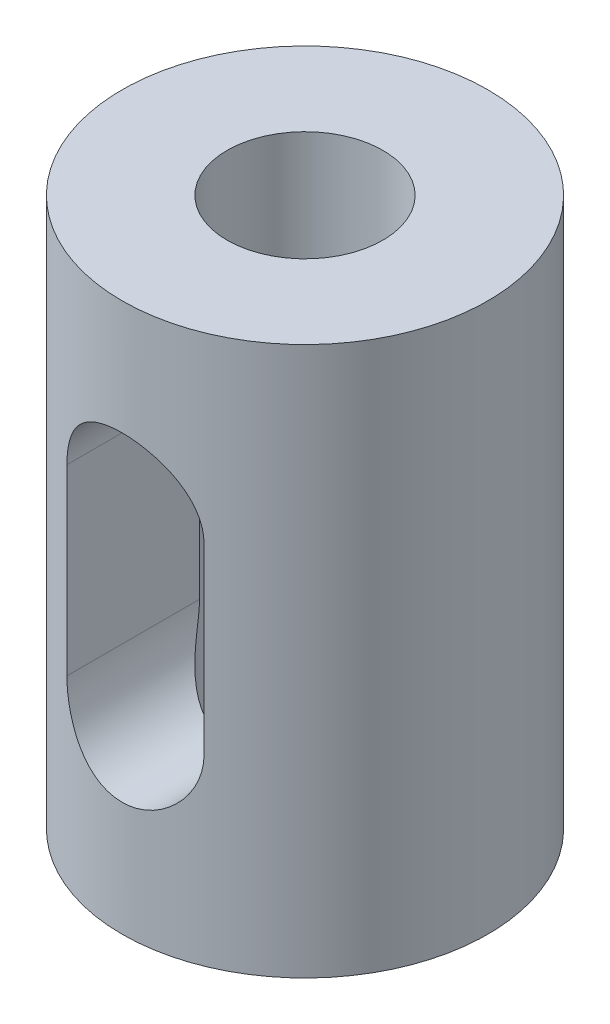
ISO-10303-21;
HEADER;
FILE_DESCRIPTION(('STEP AP214'),'2;1');
FILE_NAME('part.step','',(''),(''),'','','');
FILE_SCHEMA(('AUTOMOTIVE_DESIGN { 1 0 10303 214 1 1 1 1 }'));
ENDSEC;
DATA;
#1=APPLICATION_CONTEXT('core data for automotive mechanical design processes');
#2=APPLICATION_PROTOCOL_DEFINITION('international standard','automotive_design',2000,#1);
#3=PRODUCT_CONTEXT('',#1,'mechanical');
#4=PRODUCT('Part','Part','',(#3));
#5=PRODUCT_RELATED_PRODUCT_CATEGORY('part','',(#4));
#6=PRODUCT_DEFINITION_FORMATION('','',#4);
#7=PRODUCT_DEFINITION_CONTEXT('part definition',#1,'design');
#8=PRODUCT_DEFINITION('design','',#6,#7);
#9=PRODUCT_DEFINITION_SHAPE('','',#8);
#10=(LENGTH_UNIT() NAMED_UNIT(*) SI_UNIT(.MILLI.,.METRE.));
#11=(NAMED_UNIT(*) PLANE_ANGLE_UNIT() SI_UNIT($,.RADIAN.));
#12=(NAMED_UNIT(*) SI_UNIT($,.STERADIAN.) SOLID_ANGLE_UNIT());
#13=UNCERTAINTY_MEASURE_WITH_UNIT(LENGTH_MEASURE(1.E-05),#10,'distance_accuracy_value','');
#14=(GEOMETRIC_REPRESENTATION_CONTEXT(3) GLOBAL_UNCERTAINTY_ASSIGNED_CONTEXT((#13)) GLOBAL_UNIT_ASSIGNED_CONTEXT((#10,
#11,#12)) REPRESENTATION_CONTEXT('',''));
#15=CARTESIAN_POINT('',(0.,0.,0.));
#16=DIRECTION('',(0.,0.,1.));
#17=DIRECTION('',(1.,0.,0.));
#18=AXIS2_PLACEMENT_3D('',#15,#16,#17);
#19=CARTESIAN_POINT('',(0.,9.525,0.));
#20=DIRECTION('',(0.,-1.,0.));
#21=DIRECTION('',(0.,0.,-1.));
#22=AXIS2_PLACEMENT_3D('',#19,#20,#21);
#23=CYLINDRICAL_SURFACE('',#22,3.175);
#24=DIRECTION('',(0.,-1.,0.));
#25=VECTOR('',#24,1.);
#26=CARTESIAN_POINT('',(-1.190625,9.525,-2.94330377456609));
#27=LINE('',#26,#25);
#28=CARTESIAN_POINT('',(-1.190625,6.35,-2.94330377456609));
#29=VERTEX_POINT('',#28);
#30=CARTESIAN_POINT('',(-1.190625,3.175,-2.94330377456609));
#31=VERTEX_POINT('',#30);
#32=EDGE_CURVE('E165',#29,#31,#27,.T.);
#33=ORIENTED_EDGE('',*,*,#32,.T.);
#34=CARTESIAN_POINT('',(-1.190625,3.175,-2.94330377456609));
#35=CARTESIAN_POINT('',(-1.19062618848073,3.14277967690778,-2.94329995872857));
#36=CARTESIAN_POINT('',(-1.18931625076439,3.11057613112784,-2.94383351554502));
#37=CARTESIAN_POINT('',(-1.18409962328059,3.04642477238517,-2.94593703117006));
#38=CARTESIAN_POINT('',(-1.18019380538843,3.01447687720228,-2.94750664199915));
#39=CARTESIAN_POINT('',(-1.16466526629548,2.91959727251809,-2.95369436887438));
#40=CARTESIAN_POINT('',(-1.14923092772087,2.85734151969469,-2.95979205795841));
#41=CARTESIAN_POINT('',(-1.10879122478177,2.73655828217862,-2.97517516785815));
#42=CARTESIAN_POINT('',(-1.08379392479305,2.67802770444891,-2.98445790207025));
#43=CARTESIAN_POINT('',(-1.02500190069595,2.56592901845132,-3.00515645633822));
#44=CARTESIAN_POINT('',(-0.991199976239261,2.51236502065264,-3.01657402007336));
#45=CARTESIAN_POINT('',(-0.913976168234131,2.40911703854706,-3.04088474426551));
#46=CARTESIAN_POINT('',(-0.870190267274444,2.35971555113495,-3.05382115655563));
#47=CARTESIAN_POINT('',(-0.775013201823315,2.26875689804242,-3.07935139516824));
#48=CARTESIAN_POINT('',(-0.723620568591074,2.22720125080481,-3.09194515477271));
#49=CARTESIAN_POINT('',(-0.612531890043653,2.15174495493618,-3.11588859526652));
#50=CARTESIAN_POINT('',(-0.55261269395216,2.11815314820732,-3.1271813121393));
#51=CARTESIAN_POINT('',(-0.427476937704533,2.06164504557796,-3.14672690537256));
#52=CARTESIAN_POINT('',(-0.362262363264182,2.03872476946978,-3.15498091485232));
#53=CARTESIAN_POINT('',(-0.231370227719778,2.00520481068537,-3.16721085556145));
#54=CARTESIAN_POINT('',(-0.165833940311952,1.99411638870874,-3.17135594220028));
#55=CARTESIAN_POINT('',(-0.0337072593735785,1.98300879914146,-3.17550811124661));
#56=CARTESIAN_POINT('',(0.0328828035241809,1.98298622578848,-3.17551646682561));
#57=CARTESIAN_POINT('',(0.161721879430094,1.99372680869424,-3.17150165938149));
#58=CARTESIAN_POINT('',(0.224022668288448,2.00395639594589,-3.16767793539666));
#59=CARTESIAN_POINT('',(0.345948219071124,2.03401316519528,-3.15669026926481));
#60=CARTESIAN_POINT('',(0.405572828828377,2.05384089218802,-3.14952613744589));
#61=CARTESIAN_POINT('',(0.521484953024784,2.10277899912289,-3.13243730414583));
#62=CARTESIAN_POINT('',(0.577711250922168,2.13202031123295,-3.12247393335648));
#63=CARTESIAN_POINT('',(0.684598615222709,2.19883992982367,-3.10079480626558));
#64=CARTESIAN_POINT('',(0.735257863666696,2.23642094766869,-3.08907848045636));
#65=CARTESIAN_POINT('',(0.832712013169232,2.32141961062108,-3.06429285419527));
#66=CARTESIAN_POINT('',(0.879108122886125,2.36928373006591,-3.05118449980405));
#67=CARTESIAN_POINT('',(0.963372193449838,2.47220115666236,-3.02563755595115));
#68=CARTESIAN_POINT('',(1.00123680232957,2.5272572761264,-3.01319923119479));
#69=CARTESIAN_POINT('',(1.06813348661141,2.64458293505346,-2.99015045178193));
#70=CARTESIAN_POINT('',(1.09694552938089,2.70698785949867,-2.97958790430647));
#71=CARTESIAN_POINT('',(1.14346922163723,2.836232517962,-2.96204837787692));
#72=CARTESIAN_POINT('',(1.16119952777849,2.90306458766553,-2.95506537616461));
#73=CARTESIAN_POINT('',(1.17887172316472,3.00464618275791,-2.94803692564227));
#74=CARTESIAN_POINT('',(1.18327510053614,3.03855622405695,-2.94626884394537));
#75=CARTESIAN_POINT('',(1.18915107766906,3.10663754216694,-2.94390042682448));
#76=CARTESIAN_POINT('',(1.1906264013445,3.1408085464671,-2.94329900608927));
#77=CARTESIAN_POINT('',(1.190625,3.175,-2.94330377456609));
#78=B_SPLINE_CURVE_WITH_KNOTS('',3,(#34,#35,#36,#37,#38,#39,#40,#41,#42,#43,#44,#45,#46,#47,#48,
#49,#50,#51,#52,#53,#54,#55,#56,#57,#58,#59,#60,#61,#62,#63,#64,#65,#66,#67,#68,#69,#70,#71,#72,
#73,#74,#75,#76,#77),.UNSPECIFIED.,.F.,.F.,(4,2,2,2,2,2,2,2,2,2,2,2,2,2,2,2,2,2,2,2,2,4),(0.,
0.0965973633725355,0.19316229908422,0.385439495019381,0.577554901150599,0.769827913629831,
0.970740592641539,1.171692115472,1.37948621931291,1.58720275906571,1.78596071876867,
1.98465750622697,2.17352376479971,2.36240074870515,2.5540273495621,2.74571634263585,
2.94860657699107,3.151576387038,3.35915405166445,3.56638130093289,3.66897446974835,
3.77147215322594),.UNSPECIFIED.);
#79=CARTESIAN_POINT('',(1.190625,3.175,-2.94330377456609));
#80=VERTEX_POINT('',#79);
#81=EDGE_CURVE('E121',#31,#80,#78,.T.);
#82=ORIENTED_EDGE('',*,*,#81,.T.);
#83=DIRECTION('',(0.,-1.,0.));
#84=VECTOR('',#83,1.);
#85=CARTESIAN_POINT('',(1.190625,9.525,-2.94330377456609));
#86=LINE('',#85,#84);
#87=CARTESIAN_POINT('',(1.190625,6.35,-2.94330377456609));
#88=VERTEX_POINT('',#87);
#89=EDGE_CURVE('E171',#80,#88,#86,.F.);
#90=ORIENTED_EDGE('',*,*,#89,.T.);
#91=CARTESIAN_POINT('',(1.190625,6.35,-2.94330377456609));
#92=CARTESIAN_POINT('',(1.19062618848074,6.38222032309222,-2.94329995872857));
#93=CARTESIAN_POINT('',(1.18931625076439,6.41442386887216,-2.94383351554502));
#94=CARTESIAN_POINT('',(1.18409962328059,6.47857522761483,-2.94593703117006));
#95=CARTESIAN_POINT('',(1.18019380538843,6.51052312279772,-2.94750664199915));
#96=CARTESIAN_POINT('',(1.16466526629548,6.60540272748191,-2.95369436887438));
#97=CARTESIAN_POINT('',(1.14923092772087,6.66765848030531,-2.95979205795841));
#98=CARTESIAN_POINT('',(1.10879122478177,6.78844171782138,-2.97517516785815));
#99=CARTESIAN_POINT('',(1.08379392479306,6.84697229555109,-2.98445790207025));
#100=CARTESIAN_POINT('',(1.02500190069595,6.95907098154868,-3.00515645633822));
#101=CARTESIAN_POINT('',(0.991199976239262,7.01263497934736,-3.01657402007336));
#102=CARTESIAN_POINT('',(0.913976168234133,7.11588296145294,-3.04088474426551));
#103=CARTESIAN_POINT('',(0.870190267274445,7.16528444886505,-3.05382115655563));
#104=CARTESIAN_POINT('',(0.775013201823316,7.25624310195759,-3.07935139516824));
#105=CARTESIAN_POINT('',(0.723620568591076,7.29779874919519,-3.09194515477271));
#106=CARTESIAN_POINT('',(0.612531890043654,7.37325504506382,-3.11588859526652));
#107=CARTESIAN_POINT('',(0.552612693952161,7.40684685179268,-3.1271813121393));
#108=CARTESIAN_POINT('',(0.427476937704534,7.46335495442204,-3.14672690537256));
#109=CARTESIAN_POINT('',(0.362262363264184,7.48627523053022,-3.15498091485232));
#110=CARTESIAN_POINT('',(0.23137022771978,7.51979518931463,-3.16721085556145));
#111=CARTESIAN_POINT('',(0.165833940311954,7.53088361129126,-3.17135594220028));
#112=CARTESIAN_POINT('',(0.0337072593735799,7.54199120085854,-3.17550811124661));
#113=CARTESIAN_POINT('',(-0.0328828035241794,7.54201377421152,-3.17551646682561));
#114=CARTESIAN_POINT('',(-0.161721879430092,7.53127319130576,-3.17150165938149));
#115=CARTESIAN_POINT('',(-0.224022668288447,7.52104360405411,-3.16767793539666));
#116=CARTESIAN_POINT('',(-0.345948219071122,7.49098683480472,-3.15669026926481));
#117=CARTESIAN_POINT('',(-0.405572828828375,7.47115910781198,-3.14952613744589));
#118=CARTESIAN_POINT('',(-0.521484953024782,7.42222100087711,-3.13243730414583));
#119=CARTESIAN_POINT('',(-0.577711250922167,7.39297968876705,-3.12247393335648));
#120=CARTESIAN_POINT('',(-0.684598615222707,7.32616007017633,-3.10079480626558));
#121=CARTESIAN_POINT('',(-0.735257863666694,7.28857905233131,-3.08907848045636));
#122=CARTESIAN_POINT('',(-0.832712013169231,7.20358038937892,-3.06429285419527));
#123=CARTESIAN_POINT('',(-0.879108122886124,7.15571626993409,-3.05118449980405));
#124=CARTESIAN_POINT('',(-0.963372193449837,7.05279884333764,-3.02563755595115));
#125=CARTESIAN_POINT('',(-1.00123680232957,6.9977427238736,-3.01319923119479));
#126=CARTESIAN_POINT('',(-1.06813348661141,6.88041706494654,-2.99015045178193));
#127=CARTESIAN_POINT('',(-1.09694552938088,6.81801214050133,-2.97958790430647));
#128=CARTESIAN_POINT('',(-1.14346922163722,6.688767482038,-2.96204837787692));
#129=CARTESIAN_POINT('',(-1.16119952777849,6.62193541233447,-2.95506537616461));
#130=CARTESIAN_POINT('',(-1.17887172316472,6.52035381724209,-2.94803692564228));
#131=CARTESIAN_POINT('',(-1.18327510053614,6.48644377594305,-2.94626884394537));
#132=CARTESIAN_POINT('',(-1.18915107766906,6.41836245783306,-2.94390042682448));
#133=CARTESIAN_POINT('',(-1.1906264013445,6.3841914535329,-2.94329900608927));
#134=CARTESIAN_POINT('',(-1.190625,6.35,-2.94330377456609));
#135=B_SPLINE_CURVE_WITH_KNOTS('',3,(#91,#92,#93,#94,#95,#96,#97,#98,#99,#100,#101,#102,#103,
#104,#105,#106,#107,#108,#109,#110,#111,#112,#113,#114,#115,#116,#117,#118,#119,#120,#121,#122,
#123,#124,#125,#126,#127,#128,#129,#130,#131,#132,#133,#134),.UNSPECIFIED.,.F.,.F.,(4,2,2,2,2,2,
2,2,2,2,2,2,2,2,2,2,2,2,2,2,2,4),(0.,0.0965973633725355,0.19316229908422,0.38543949501938,
0.5775549011506,0.769827913629831,0.97074059264154,1.171692115472,1.37948621931291,
1.58720275906571,1.78596071876867,1.98465750622696,2.17352376479971,2.36240074870515,
2.5540273495621,2.74571634263585,2.94860657699107,3.151576387038,3.35915405166445,
3.5663813009329,3.66897446974835,3.77147215322594),.UNSPECIFIED.);
#136=EDGE_CURVE('E177',#88,#29,#135,.T.);
#137=ORIENTED_EDGE('',*,*,#136,.T.);
#138=EDGE_LOOP('',(#33,#82,#90,#137));
#139=FACE_BOUND('',#138,.T.);
#140=DIRECTION('',(0.,-1.,0.));
#141=VECTOR('',#140,1.);
#142=CARTESIAN_POINT('',(1.190625,9.525,2.94330377456609));
#143=LINE('',#142,#141);
#144=CARTESIAN_POINT('',(1.190625,6.35,2.94330377456609));
#145=VERTEX_POINT('',#144);
#146=CARTESIAN_POINT('',(1.190625,3.175,2.94330377456609));
#147=VERTEX_POINT('',#146);
#148=EDGE_CURVE('E174',#145,#147,#143,.T.);
#149=ORIENTED_EDGE('',*,*,#148,.T.);
#150=CARTESIAN_POINT('',(1.190625,3.175,2.94330377456609));
#151=CARTESIAN_POINT('',(1.19062618848074,3.14277967690778,2.94329995872857));
#152=CARTESIAN_POINT('',(1.18931625076439,3.11057613112784,2.94383351554502));
#153=CARTESIAN_POINT('',(1.18409962328059,3.04642477238517,2.94593703117006));
#154=CARTESIAN_POINT('',(1.18019380538843,3.01447687720228,2.94750664199915));
#155=CARTESIAN_POINT('',(1.16466526629548,2.91959727251809,2.95369436887438));
#156=CARTESIAN_POINT('',(1.14923092772087,2.85734151969469,2.95979205795841));
#157=CARTESIAN_POINT('',(1.10879122478177,2.73655828217862,2.97517516785815));
#158=CARTESIAN_POINT('',(1.08379392479306,2.67802770444891,2.98445790207024));
#159=CARTESIAN_POINT('',(1.02500190069595,2.56592901845132,3.00515645633822));
#160=CARTESIAN_POINT('',(0.991199976239262,2.51236502065264,3.01657402007336));
#161=CARTESIAN_POINT('',(0.913976168234133,2.40911703854706,3.04088474426551));
#162=CARTESIAN_POINT('',(0.870190267274446,2.35971555113495,3.05382115655563));
#163=CARTESIAN_POINT('',(0.775013201823317,2.26875689804242,3.07935139516824));
#164=CARTESIAN_POINT('',(0.723620568591076,2.22720125080481,3.09194515477271));
#165=CARTESIAN_POINT('',(0.612531890043654,2.15174495493618,3.11588859526652));
#166=CARTESIAN_POINT('',(0.552612693952162,2.11815314820732,3.1271813121393));
#167=CARTESIAN_POINT('',(0.427476937704534,2.06164504557796,3.14672690537256));
#168=CARTESIAN_POINT('',(0.362262363264184,2.03872476946978,3.15498091485232));
#169=CARTESIAN_POINT('',(0.23137022771978,2.00520481068537,3.16721085556145));
#170=CARTESIAN_POINT('',(0.165833940311954,1.99411638870874,3.17135594220028));
#171=CARTESIAN_POINT('',(0.0337072593735801,1.98300879914146,3.17550811124661));
#172=CARTESIAN_POINT('',(-0.0328828035241793,1.98298622578848,3.17551646682561));
#173=CARTESIAN_POINT('',(-0.161721879430092,1.99372680869424,3.17150165938149));
#174=CARTESIAN_POINT('',(-0.224022668288447,2.00395639594589,3.16767793539666));
#175=CARTESIAN_POINT('',(-0.345948219071122,2.03401316519528,3.15669026926481));
#176=CARTESIAN_POINT('',(-0.405572828828375,2.05384089218802,3.14952613744589));
#177=CARTESIAN_POINT('',(-0.521484953024782,2.10277899912289,3.13243730414583));
#178=CARTESIAN_POINT('',(-0.577711250922167,2.13202031123295,3.12247393335648));
#179=CARTESIAN_POINT('',(-0.684598615222707,2.19883992982367,3.10079480626558));
#180=CARTESIAN_POINT('',(-0.735257863666694,2.23642094766869,3.08907848045636));
#181=CARTESIAN_POINT('',(-0.832712013169231,2.32141961062108,3.06429285419527));
#182=CARTESIAN_POINT('',(-0.879108122886124,2.36928373006591,3.05118449980405));
#183=CARTESIAN_POINT('',(-0.963372193449837,2.47220115666236,3.02563755595115));
#184=CARTESIAN_POINT('',(-1.00123680232957,2.5272572761264,3.01319923119479));
#185=CARTESIAN_POINT('',(-1.06813348661141,2.64458293505346,2.99015045178193));
#186=CARTESIAN_POINT('',(-1.09694552938088,2.70698785949867,2.97958790430647));
#187=CARTESIAN_POINT('',(-1.14346922163723,2.836232517962,2.96204837787692));
#188=CARTESIAN_POINT('',(-1.16119952777849,2.90306458766553,2.95506537616461));
#189=CARTESIAN_POINT('',(-1.17887172316472,3.00464618275791,2.94803692564228));
#190=CARTESIAN_POINT('',(-1.18327510053614,3.03855622405695,2.94626884394537));
#191=CARTESIAN_POINT('',(-1.18915107766906,3.10663754216693,2.94390042682448));
#192=CARTESIAN_POINT('',(-1.1906264013445,3.1408085464671,2.94329900608927));
#193=CARTESIAN_POINT('',(-1.190625,3.175,2.94330377456609));
#194=B_SPLINE_CURVE_WITH_KNOTS('',3,(#150,#151,#152,#153,#154,#155,#156,#157,#158,#159,#160,
#161,#162,#163,#164,#165,#166,#167,#168,#169,#170,#171,#172,#173,#174,#175,#176,#177,#178,#179,
#180,#181,#182,#183,#184,#185,#186,#187,#188,#189,#190,#191,#192,#193),.UNSPECIFIED.,.F.,.F.,(4,
2,2,2,2,2,2,2,2,2,2,2,2,2,2,2,2,2,2,2,2,4),(0.,0.0965973633725355,0.19316229908422,
0.38543949501938,0.577554901150599,0.769827913629831,0.970740592641539,1.171692115472,
1.37948621931291,1.58720275906571,1.78596071876867,1.98465750622697,2.17352376479971,
2.36240074870515,2.5540273495621,2.74571634263585,2.94860657699107,3.151576387038,
3.35915405166445,3.5663813009329,3.66897446974835,3.77147215322594),.UNSPECIFIED.);
#195=CARTESIAN_POINT('',(-1.190625,3.175,2.94330377456609));
#196=VERTEX_POINT('',#195);
#197=EDGE_CURVE('E164',#147,#196,#194,.T.);
#198=ORIENTED_EDGE('',*,*,#197,.T.);
#199=DIRECTION('',(0.,-1.,0.));
#200=VECTOR('',#199,1.);
#201=CARTESIAN_POINT('',(-1.190625,9.525,2.94330377456609));
#202=LINE('',#201,#200);
#203=CARTESIAN_POINT('',(-1.190625,6.35,2.94330377456609));
#204=VERTEX_POINT('',#203);
#205=EDGE_CURVE('E216',#196,#204,#202,.F.);
#206=ORIENTED_EDGE('',*,*,#205,.T.);
#207=CARTESIAN_POINT('',(-1.190625,6.35,2.94330377456609));
#208=CARTESIAN_POINT('',(-1.19062618848073,6.38222032309222,2.94329995872857));
#209=CARTESIAN_POINT('',(-1.18931625076439,6.41442386887216,2.94383351554502));
#210=CARTESIAN_POINT('',(-1.18409962328059,6.47857522761483,2.94593703117006));
#211=CARTESIAN_POINT('',(-1.18019380538843,6.51052312279772,2.94750664199916));
#212=CARTESIAN_POINT('',(-1.16466526629548,6.60540272748191,2.95369436887438));
#213=CARTESIAN_POINT('',(-1.14923092772087,6.66765848030531,2.95979205795841));
#214=CARTESIAN_POINT('',(-1.10879122478177,6.78844171782138,2.97517516785815));
#215=CARTESIAN_POINT('',(-1.08379392479305,6.84697229555109,2.98445790207025));
#216=CARTESIAN_POINT('',(-1.02500190069595,6.95907098154868,3.00515645633822));
#217=CARTESIAN_POINT('',(-0.991199976239261,7.01263497934736,3.01657402007336));
#218=CARTESIAN_POINT('',(-0.913976168234131,7.11588296145294,3.04088474426551));
#219=CARTESIAN_POINT('',(-0.870190267274444,7.16528444886505,3.05382115655563));
#220=CARTESIAN_POINT('',(-0.775013201823315,7.25624310195759,3.07935139516824));
#221=CARTESIAN_POINT('',(-0.723620568591074,7.29779874919519,3.09194515477271));
#222=CARTESIAN_POINT('',(-0.612531890043652,7.37325504506382,3.11588859526652));
#223=CARTESIAN_POINT('',(-0.55261269395216,7.40684685179269,3.1271813121393));
#224=CARTESIAN_POINT('',(-0.427476937704533,7.46335495442204,3.14672690537256));
#225=CARTESIAN_POINT('',(-0.362262363264182,7.48627523053022,3.15498091485232));
#226=CARTESIAN_POINT('',(-0.231370227719778,7.51979518931463,3.16721085556145));
#227=CARTESIAN_POINT('',(-0.165833940311952,7.53088361129126,3.17135594220028));
#228=CARTESIAN_POINT('',(-0.0337072593735782,7.54199120085854,3.17550811124661));
#229=CARTESIAN_POINT('',(0.0328828035241812,7.54201377421152,3.17551646682561));
#230=CARTESIAN_POINT('',(0.161721879430094,7.53127319130576,3.17150165938149));
#231=CARTESIAN_POINT('',(0.224022668288449,7.52104360405411,3.16767793539666));
#232=CARTESIAN_POINT('',(0.345948219071124,7.49098683480472,3.15669026926481));
#233=CARTESIAN_POINT('',(0.405572828828377,7.47115910781198,3.14952613744589));
#234=CARTESIAN_POINT('',(0.521484953024784,7.42222100087711,3.13243730414583));
#235=CARTESIAN_POINT('',(0.577711250922168,7.39297968876705,3.12247393335648));
#236=CARTESIAN_POINT('',(0.684598615222709,7.32616007017633,3.10079480626558));
#237=CARTESIAN_POINT('',(0.735257863666696,7.28857905233131,3.08907848045636));
#238=CARTESIAN_POINT('',(0.832712013169232,7.20358038937892,3.06429285419527));
#239=CARTESIAN_POINT('',(0.879108122886125,7.15571626993409,3.05118449980405));
#240=CARTESIAN_POINT('',(0.963372193449838,7.05279884333764,3.02563755595115));
#241=CARTESIAN_POINT('',(1.00123680232957,6.9977427238736,3.01319923119479));
#242=CARTESIAN_POINT('',(1.06813348661141,6.88041706494654,2.99015045178193));
#243=CARTESIAN_POINT('',(1.09694552938089,6.81801214050133,2.97958790430647));
#244=CARTESIAN_POINT('',(1.14346922163723,6.688767482038,2.96204837787692));
#245=CARTESIAN_POINT('',(1.16119952777849,6.62193541233447,2.95506537616461));
#246=CARTESIAN_POINT('',(1.17887172316472,6.52035381724209,2.94803692564227));
#247=CARTESIAN_POINT('',(1.18327510053614,6.48644377594305,2.94626884394537));
#248=CARTESIAN_POINT('',(1.18915107766906,6.41836245783306,2.94390042682448));
#249=CARTESIAN_POINT('',(1.1906264013445,6.3841914535329,2.94329900608927));
#250=CARTESIAN_POINT('',(1.190625,6.35,2.94330377456609));
#251=B_SPLINE_CURVE_WITH_KNOTS('',3,(#207,#208,#209,#210,#211,#212,#213,#214,#215,#216,#217,
#218,#219,#220,#221,#222,#223,#224,#225,#226,#227,#228,#229,#230,#231,#232,#233,#234,#235,#236,
#237,#238,#239,#240,#241,#242,#243,#244,#245,#246,#247,#248,#249,#250),.UNSPECIFIED.,.F.,.F.,(4,
2,2,2,2,2,2,2,2,2,2,2,2,2,2,2,2,2,2,2,2,4),(0.,0.0965973633725346,0.19316229908422,
0.385439495019381,0.5775549011506,0.769827913629832,0.97074059264154,1.171692115472,
1.37948621931291,1.58720275906572,1.78596071876867,1.98465750622697,2.17352376479971,
2.36240074870515,2.5540273495621,2.74571634263585,2.94860657699107,3.151576387038,
3.35915405166445,3.5663813009329,3.66897446974835,3.77147215322594),.UNSPECIFIED.);
#252=EDGE_CURVE('E182',#204,#145,#251,.T.);
#253=ORIENTED_EDGE('',*,*,#252,.T.);
#254=EDGE_LOOP('',(#149,#198,#206,#253));
#255=FACE_BOUND('',#254,.T.);
#256=CARTESIAN_POINT('',(0.,9.525,0.));
#257=DIRECTION('',(0.,1.,0.));
#258=DIRECTION('',(0.,0.,1.));
#259=AXIS2_PLACEMENT_3D('',#256,#257,#258);
#260=CIRCLE('',#259,3.175);
#261=CARTESIAN_POINT('',(0.,9.525,3.175));
#262=VERTEX_POINT('',#261);
#263=EDGE_CURVE('E115',#262,#262,#260,.T.);
#264=ORIENTED_EDGE('',*,*,#263,.F.);
#265=EDGE_LOOP('',(#264));
#266=FACE_BOUND('',#265,.T.);
#267=CARTESIAN_POINT('',(0.,0.,0.));
#268=DIRECTION('',(0.,1.,0.));
#269=DIRECTION('',(0.,0.,1.));
#270=AXIS2_PLACEMENT_3D('',#267,#268,#269);
#271=CIRCLE('',#270,3.175);
#272=CARTESIAN_POINT('',(0.,0.,3.175));
#273=VERTEX_POINT('',#272);
#274=EDGE_CURVE('E229',#273,#273,#271,.T.);
#275=ORIENTED_EDGE('',*,*,#274,.T.);
#276=EDGE_LOOP('',(#275));
#277=FACE_BOUND('',#276,.T.);
#278=ADVANCED_FACE('F36',(#139,#255,#266,#277),#23,.T.);
#279=CARTESIAN_POINT('',(0.,9.525,0.));
#280=DIRECTION('',(0.,1.,0.));
#281=DIRECTION('',(0.,0.,1.));
#282=AXIS2_PLACEMENT_3D('',#279,#280,#281);
#283=PLANE('',#282);
#284=CARTESIAN_POINT('',(0.,9.525,0.));
#285=DIRECTION('',(0.,1.,0.));
#286=DIRECTION('',(0.,0.,1.));
#287=AXIS2_PLACEMENT_3D('',#284,#285,#286);
#288=CIRCLE('',#287,1.35254999999999);
#289=CARTESIAN_POINT('',(0.,9.525,1.35254999999999));
#290=VERTEX_POINT('',#289);
#291=EDGE_CURVE('E223',#290,#290,#288,.T.);
#292=ORIENTED_EDGE('',*,*,#291,.F.);
#293=EDGE_LOOP('',(#292));
#294=FACE_BOUND('',#293,.T.);
#295=ORIENTED_EDGE('',*,*,#263,.T.);
#296=EDGE_LOOP('',(#295));
#297=FACE_BOUND('',#296,.T.);
#298=ADVANCED_FACE('F239',(#294,#297),#283,.T.);
#299=CARTESIAN_POINT('',(0.,0.,0.));
#300=DIRECTION('',(0.,1.,0.));
#301=DIRECTION('',(0.,0.,1.));
#302=AXIS2_PLACEMENT_3D('',#299,#300,#301);
#303=PLANE('',#302);
#304=CARTESIAN_POINT('',(0.,0.,0.));
#305=DIRECTION('',(0.,1.,0.));
#306=DIRECTION('',(0.,0.,1.));
#307=AXIS2_PLACEMENT_3D('',#304,#305,#306);
#308=CIRCLE('',#307,1.35255);
#309=CARTESIAN_POINT('',(0.,0.,1.35255));
#310=VERTEX_POINT('',#309);
#311=EDGE_CURVE('E225',#310,#310,#308,.T.);
#312=ORIENTED_EDGE('',*,*,#311,.T.);
#313=EDGE_LOOP('',(#312));
#314=FACE_BOUND('',#313,.T.);
#315=ORIENTED_EDGE('',*,*,#274,.F.);
#316=EDGE_LOOP('',(#315));
#317=FACE_BOUND('',#316,.T.);
#318=ADVANCED_FACE('F237',(#314,#317),#303,.F.);
#319=CARTESIAN_POINT('',(0.,9.525,0.));
#320=DIRECTION('',(0.,1.,0.));
#321=DIRECTION('',(0.,0.,1.));
#322=AXIS2_PLACEMENT_3D('',#319,#320,#321);
#323=CYLINDRICAL_SURFACE('',#322,1.35255);
#324=DIRECTION('',(0.,1.,0.));
#325=VECTOR('',#324,1.);
#326=CARTESIAN_POINT('',(1.190625,9.525,0.641719262508916));
#327=LINE('',#326,#325);
#328=CARTESIAN_POINT('',(1.190625,3.175,0.641719262508915));
#329=VERTEX_POINT('',#328);
#330=CARTESIAN_POINT('',(1.190625,6.35,0.641719262508915));
#331=VERTEX_POINT('',#330);
#332=EDGE_CURVE('E49',#329,#331,#327,.T.);
#333=ORIENTED_EDGE('',*,*,#332,.T.);
#334=CARTESIAN_POINT('',(1.190625,6.35,0.641719262508915));
#335=CARTESIAN_POINT('',(1.19066571986986,6.38834607020843,0.641557283796456));
#336=CARTESIAN_POINT('',(1.18877671130535,6.42640752659745,0.645159975697117));
#337=CARTESIAN_POINT('',(1.18163354304275,6.50054670988399,0.658189685094697));
#338=CARTESIAN_POINT('',(1.17643868152506,6.53664746325981,0.667513969199227));
#339=CARTESIAN_POINT('',(1.16007943597601,6.62305249196192,0.695670267302342));
#340=CARTESIAN_POINT('',(1.14726605696047,6.67221514491697,0.716904554229075));
#341=CARTESIAN_POINT('',(1.11637320142792,6.76689860709206,0.764143578702337));
#342=CARTESIAN_POINT('',(1.09824091278728,6.81237675413772,0.790195139104773));
#343=CARTESIAN_POINT('',(1.06119209954145,6.89126245783644,0.839055412831132));
#344=CARTESIAN_POINT('',(1.04311725574554,6.92529499603825,0.861506509468474));
#345=CARTESIAN_POINT('',(1.00392780188969,6.99124028807586,0.9068748266963));
#346=CARTESIAN_POINT('',(0.982811517166428,7.02315185983498,0.929792298070678));
#347=CARTESIAN_POINT('',(0.915027051080603,7.11560207867653,0.998103073778938));
#348=CARTESIAN_POINT('',(0.863794173154389,7.17312936913519,1.04323591236457));
#349=CARTESIAN_POINT('',(0.762372803561192,7.26648750959074,1.11857217043411));
#350=CARTESIAN_POINT('',(0.714714855916177,7.30425220432807,1.14980592809482));
#351=CARTESIAN_POINT('',(0.612166951629826,7.37305309974829,1.20751261864862));
#352=CARTESIAN_POINT('',(0.557287251332537,7.40409868057973,1.23399217966486));
#353=CARTESIAN_POINT('',(0.451951626487715,7.45273589459485,1.27581697055307));
#354=CARTESIAN_POINT('',(0.402622303022454,7.47176159003543,1.29232087308629));
#355=CARTESIAN_POINT('',(0.300453887999347,7.50332861487712,1.31981424758843));
#356=CARTESIAN_POINT('',(0.247617087213404,7.51587413043744,1.33080727941271));
#357=CARTESIAN_POINT('',(0.139488819454769,7.53370043500551,1.34645159576843));
#358=CARTESIAN_POINT('',(0.0841856260710279,7.53894158177567,1.35106827337483));
#359=CARTESIAN_POINT('',(-0.0267534649621882,7.54161572912651,1.35342198508186));
#360=CARTESIAN_POINT('',(-0.0823892849442551,7.53905048647611,1.35116056704597));
#361=CARTESIAN_POINT('',(-0.187253125075297,7.52688841046121,1.34047111972752));
#362=CARTESIAN_POINT('',(-0.236615609029978,7.51792705813478,1.33260048883759));
#363=CARTESIAN_POINT('',(-0.332832274421573,7.49423225115122,1.31188341527577));
#364=CARTESIAN_POINT('',(-0.37968576211685,7.47949720933094,1.29903560440888));
#365=CARTESIAN_POINT('',(-0.473016886813022,7.44384714033267,1.26815628184314));
#366=CARTESIAN_POINT('',(-0.519267325167168,7.42258952122185,1.2498395179662));
#367=CARTESIAN_POINT('',(-0.607409329365307,7.37525491556587,1.2094623600228));
#368=CARTESIAN_POINT('',(-0.649300358954843,7.34917733720628,1.18740150626882));
#369=CARTESIAN_POINT('',(-0.749085284207006,7.27838721216955,1.1283384220489));
#370=CARTESIAN_POINT('',(-0.804024248150757,7.23102023065884,1.08951718440938));
#371=CARTESIAN_POINT('',(-0.903663359292781,7.12854444430443,1.00842683014318));
#372=CARTESIAN_POINT('',(-0.948309652641228,7.07339724912523,0.966141080616887));
#373=CARTESIAN_POINT('',(-1.00796250555843,6.98474578416077,0.902375127553333));
#374=CARTESIAN_POINT('',(-1.02680119161743,6.95381231714763,0.880811645922081));
#375=CARTESIAN_POINT('',(-1.06176912097472,6.88996459122611,0.838327690813686));
#376=CARTESIAN_POINT('',(-1.0778960706015,6.85704868715007,0.817407773780588));
#377=CARTESIAN_POINT('',(-1.10723467378814,6.78928911285123,0.777198657913559));
#378=CARTESIAN_POINT('',(-1.12046352565989,6.75445843973347,0.757900282494241));
#379=CARTESIAN_POINT('',(-1.14388589922635,6.68247660369727,0.722061776725092));
#380=CARTESIAN_POINT('',(-1.15408580578302,6.64533052456283,0.705515877169908));
#381=CARTESIAN_POINT('',(-1.1699906069883,6.5733647851253,0.678766995607848));
#382=CARTESIAN_POINT('',(-1.17609979404043,6.53884119627207,0.668027652887394));
#383=CARTESIAN_POINT('',(-1.18526074727091,6.46828760285962,0.651647431829505));
#384=CARTESIAN_POINT('',(-1.18832649424939,6.43226528625812,0.645983251279205));
#385=CARTESIAN_POINT('',(-1.19033103214479,6.38069249179808,0.642261050132442));
#386=CARTESIAN_POINT('',(-1.190631067271,6.36534670128189,0.641698834812891));
#387=CARTESIAN_POINT('',(-1.19062500000001,6.3499999999997,0.641719262513177));
#388=B_SPLINE_CURVE_WITH_KNOTS('',3,(#334,#335,#336,#337,#338,#339,#340,#341,#342,#343,#344,
#345,#346,#347,#348,#349,#350,#351,#352,#353,#354,#355,#356,#357,#358,#359,#360,#361,#362,#363,
#364,#365,#366,#367,#368,#369,#370,#371,#372,#373,#374,#375,#376,#377,#378,#379,#380,#381,#382,
#383,#384,#385,#386,#387),.UNSPECIFIED.,.F.,.F.,(4,2,2,2,2,2,2,2,2,2,2,2,2,2,2,2,2,2,2,2,2,2,2,
2,2,2,4),(0.,0.114373028930709,0.226750212329602,0.391034858731891,0.557009360758271,
0.690634165768087,0.824332829896228,1.0906851816613,1.29506494995732,1.49915752879066,
1.66464740081118,1.83003023319679,1.99630718071365,2.16254671162803,2.31422746765066,
2.46594994936578,2.62764669660429,2.7893633108394,3.03487301904939,3.28163953049276,
3.40798723023035,3.5344412670139,3.66012323224913,3.7855383544161,3.89516064083094,
4.00427698687415,4.05030898369704),.UNSPECIFIED.);
#389=CARTESIAN_POINT('',(-1.190625,6.35,0.641719262508917));
#390=VERTEX_POINT('',#389);
#391=EDGE_CURVE('E11',#331,#390,#388,.T.);
#392=ORIENTED_EDGE('',*,*,#391,.T.);
#393=DIRECTION('',(0.,1.,0.));
#394=VECTOR('',#393,1.);
#395=CARTESIAN_POINT('',(-1.190625,9.525,0.641719262508917));
#396=LINE('',#395,#394);
#397=CARTESIAN_POINT('',(-1.190625,3.175,0.641719262508917));
#398=VERTEX_POINT('',#397);
#399=EDGE_CURVE('E198',#390,#398,#396,.F.);
#400=ORIENTED_EDGE('',*,*,#399,.T.);
#401=CARTESIAN_POINT('',(-1.190625,3.175,0.641719262508917));
#402=CARTESIAN_POINT('',(-1.19066571986986,3.13665392979157,0.641557283796457));
#403=CARTESIAN_POINT('',(-1.18877671130534,3.09859247340255,0.645159975697118));
#404=CARTESIAN_POINT('',(-1.18163354304275,3.02445329011601,0.658189685094699));
#405=CARTESIAN_POINT('',(-1.17643868152506,2.98835253674019,0.667513969199228));
#406=CARTESIAN_POINT('',(-1.16007943597601,2.90194750803808,0.695670267302343));
#407=CARTESIAN_POINT('',(-1.14726605696047,2.85278485508303,0.716904554229077));
#408=CARTESIAN_POINT('',(-1.11637320142791,2.75810139290794,0.764143578702339));
#409=CARTESIAN_POINT('',(-1.09824091278728,2.71262324586227,0.790195139104776));
#410=CARTESIAN_POINT('',(-1.06119209954145,2.63373754216355,0.839055412831135));
#411=CARTESIAN_POINT('',(-1.04311725574554,2.59970500396175,0.861506509468477));
#412=CARTESIAN_POINT('',(-1.00392780188969,2.53375971192414,0.906874826696303));
#413=CARTESIAN_POINT('',(-0.982811517166426,2.50184814016502,0.929792298070681));
#414=CARTESIAN_POINT('',(-0.9150270510806,2.40939792132347,0.99810307377894));
#415=CARTESIAN_POINT('',(-0.863794173154386,2.35187063086481,1.04323591236457));
#416=CARTESIAN_POINT('',(-0.762372803561189,2.25851249040926,1.11857217043411));
#417=CARTESIAN_POINT('',(-0.714714855916174,2.22074779567193,1.14980592809482));
#418=CARTESIAN_POINT('',(-0.612166951629823,2.15194690025171,1.20751261864862));
#419=CARTESIAN_POINT('',(-0.557287251332535,2.12090131942027,1.23399217966486));
#420=CARTESIAN_POINT('',(-0.451951626487712,2.07226410540515,1.27581697055307));
#421=CARTESIAN_POINT('',(-0.402622303022452,2.05323840996456,1.29232087308629));
#422=CARTESIAN_POINT('',(-0.300453887999345,2.02167138512288,1.31981424758843));
#423=CARTESIAN_POINT('',(-0.247617087213401,2.00912586956256,1.33080727941271));
#424=CARTESIAN_POINT('',(-0.139488819454766,1.99129956499449,1.34645159576843));
#425=CARTESIAN_POINT('',(-0.0841856260710256,1.98605841822433,1.35106827337483));
#426=CARTESIAN_POINT('',(0.0267534649621903,1.98338427087349,1.35342198508186));
#427=CARTESIAN_POINT('',(0.0823892849442571,1.98594951352389,1.35116056704597));
#428=CARTESIAN_POINT('',(0.187253125075299,1.99811158953879,1.34047111972752));
#429=CARTESIAN_POINT('',(0.23661560902998,2.00707294186522,1.33260048883759));
#430=CARTESIAN_POINT('',(0.332832274421574,2.03076774884878,1.31188341527577));
#431=CARTESIAN_POINT('',(0.379685762116852,2.04550279066906,1.29903560440888));
#432=CARTESIAN_POINT('',(0.473016886813024,2.08115285966733,1.26815628184314));
#433=CARTESIAN_POINT('',(0.519267325167171,2.10241047877815,1.24983951796619));
#434=CARTESIAN_POINT('',(0.60740932936531,2.14974508443413,1.2094623600228));
#435=CARTESIAN_POINT('',(0.649300358954845,2.17582266279372,1.18740150626882));
#436=CARTESIAN_POINT('',(0.749085284207009,2.24661278783045,1.1283384220489));
#437=CARTESIAN_POINT('',(0.80402424815076,2.29397976934116,1.08951718440938));
#438=CARTESIAN_POINT('',(0.903663359292783,2.39645555569557,1.00842683014317));
#439=CARTESIAN_POINT('',(0.94830965264123,2.45160275087477,0.966141080616884));
#440=CARTESIAN_POINT('',(1.00796250555843,2.54025421583924,0.90237512755333));
#441=CARTESIAN_POINT('',(1.02680119161744,2.57118768285237,0.880811645922077));
#442=CARTESIAN_POINT('',(1.06176912097473,2.63503540877389,0.838327690813682));
#443=CARTESIAN_POINT('',(1.0778960706015,2.66795131284993,0.817407773780585));
#444=CARTESIAN_POINT('',(1.10723467378814,2.73571088714877,0.777198657913557));
#445=CARTESIAN_POINT('',(1.12046352565989,2.77054156026653,0.757900282494238));
#446=CARTESIAN_POINT('',(1.14388589922635,2.84252339630273,0.722061776725089));
#447=CARTESIAN_POINT('',(1.15408580578303,2.87966947543717,0.705515877169906));
#448=CARTESIAN_POINT('',(1.1699906069883,2.95163521487471,0.678766995607846));
#449=CARTESIAN_POINT('',(1.17609979404043,2.98615880372793,0.668027652887392));
#450=CARTESIAN_POINT('',(1.18526074727091,3.05671239714038,0.651647431829502));
#451=CARTESIAN_POINT('',(1.18832649424939,3.09273471374188,0.645983251279202));
#452=CARTESIAN_POINT('',(1.19033103214479,3.14430750820192,0.64226105013244));
#453=CARTESIAN_POINT('',(1.190631067271,3.15965329871811,0.641698834812889));
#454=CARTESIAN_POINT('',(1.19062500000002,3.1750000000003,0.641719262513175));
#455=B_SPLINE_CURVE_WITH_KNOTS('',3,(#401,#402,#403,#404,#405,#406,#407,#408,#409,#410,#411,
#412,#413,#414,#415,#416,#417,#418,#419,#420,#421,#422,#423,#424,#425,#426,#427,#428,#429,#430,
#431,#432,#433,#434,#435,#436,#437,#438,#439,#440,#441,#442,#443,#444,#445,#446,#447,#448,#449,
#450,#451,#452,#453,#454),.UNSPECIFIED.,.F.,.F.,(4,2,2,2,2,2,2,2,2,2,2,2,2,2,2,2,2,2,2,2,2,2,2,
2,2,2,4),(0.,0.114373028930709,0.226750212329602,0.391034858731894,0.557009360758274,
0.690634165768091,0.824332829896231,1.09068518166131,1.29506494995732,1.49915752879066,
1.66464740081119,1.8300302331968,1.99630718071365,2.16254671162803,2.31422746765066,
2.46594994936578,2.62764669660429,2.7893633108394,3.0348730190494,3.28163953049276,
3.40798723023035,3.5344412670139,3.66012323224913,3.78553835441611,3.89516064083094,
4.00427698687415,4.05030898369704),.UNSPECIFIED.);
#456=EDGE_CURVE('E154',#398,#329,#455,.T.);
#457=ORIENTED_EDGE('',*,*,#456,.T.);
#458=EDGE_LOOP('',(#333,#392,#400,#457));
#459=FACE_BOUND('',#458,.T.);
#460=DIRECTION('',(0.,1.,0.));
#461=VECTOR('',#460,1.);
#462=CARTESIAN_POINT('',(-1.190625,9.525,-0.641719262508917));
#463=LINE('',#462,#461);
#464=CARTESIAN_POINT('',(-1.190625,3.175,-0.641719262508917));
#465=VERTEX_POINT('',#464);
#466=CARTESIAN_POINT('',(-1.190625,6.35,-0.641719262508917));
#467=VERTEX_POINT('',#466);
#468=EDGE_CURVE('E106',#465,#467,#463,.T.);
#469=ORIENTED_EDGE('',*,*,#468,.T.);
#470=CARTESIAN_POINT('',(-1.190625,6.35,-0.641719262508917));
#471=CARTESIAN_POINT('',(-1.19066571986986,6.38834607020843,-0.641557283796458));
#472=CARTESIAN_POINT('',(-1.18877671130534,6.42640752659745,-0.645159975697119));
#473=CARTESIAN_POINT('',(-1.18163354304275,6.50054670988399,-0.658189685094699));
#474=CARTESIAN_POINT('',(-1.17643868152506,6.53664746325981,-0.667513969199228));
#475=CARTESIAN_POINT('',(-1.16007943597601,6.62305249196192,-0.695670267302344));
#476=CARTESIAN_POINT('',(-1.14726605696047,6.67221514491697,-0.716904554229078));
#477=CARTESIAN_POINT('',(-1.11637320142791,6.76689860709206,-0.76414357870234));
#478=CARTESIAN_POINT('',(-1.09824091278728,6.81237675413773,-0.790195139104776));
#479=CARTESIAN_POINT('',(-1.06119209954145,6.89126245783645,-0.839055412831135));
#480=CARTESIAN_POINT('',(-1.04311725574554,6.92529499603825,-0.861506509468477));
#481=CARTESIAN_POINT('',(-1.00392780188969,6.99124028807586,-0.906874826696304));
#482=CARTESIAN_POINT('',(-0.982811517166426,7.02315185983498,-0.929792298070681));
#483=CARTESIAN_POINT('',(-0.9150270510806,7.11560207867653,-0.99810307377894));
#484=CARTESIAN_POINT('',(-0.863794173154386,7.17312936913519,-1.04323591236457));
#485=CARTESIAN_POINT('',(-0.762372803561189,7.26648750959074,-1.11857217043411));
#486=CARTESIAN_POINT('',(-0.714714855916175,7.30425220432807,-1.14980592809482));
#487=CARTESIAN_POINT('',(-0.612166951629824,7.37305309974829,-1.20751261864862));
#488=CARTESIAN_POINT('',(-0.557287251332536,7.40409868057973,-1.23399217966486));
#489=CARTESIAN_POINT('',(-0.451951626487713,7.45273589459485,-1.27581697055307));
#490=CARTESIAN_POINT('',(-0.402622303022453,7.47176159003543,-1.29232087308629));
#491=CARTESIAN_POINT('',(-0.300453887999346,7.50332861487712,-1.31981424758843));
#492=CARTESIAN_POINT('',(-0.247617087213402,7.51587413043744,-1.33080727941271));
#493=CARTESIAN_POINT('',(-0.139488819454767,7.53370043500551,-1.34645159576843));
#494=CARTESIAN_POINT('',(-0.0841856260710265,7.53894158177567,-1.35106827337483));
#495=CARTESIAN_POINT('',(0.0267534649621894,7.54161572912651,-1.35342198508186));
#496=CARTESIAN_POINT('',(0.0823892849442561,7.53905048647611,-1.35116056704597));
#497=CARTESIAN_POINT('',(0.187253125075298,7.52688841046121,-1.34047111972752));
#498=CARTESIAN_POINT('',(0.236615609029979,7.51792705813478,-1.33260048883759));
#499=CARTESIAN_POINT('',(0.332832274421573,7.49423225115122,-1.31188341527577));
#500=CARTESIAN_POINT('',(0.379685762116851,7.47949720933094,-1.29903560440888));
#501=CARTESIAN_POINT('',(0.473016886813023,7.44384714033267,-1.26815628184314));
#502=CARTESIAN_POINT('',(0.519267325167169,7.42258952122185,-1.24983951796619));
#503=CARTESIAN_POINT('',(0.607409329365308,7.37525491556587,-1.2094623600228));
#504=CARTESIAN_POINT('',(0.649300358954844,7.34917733720628,-1.18740150626882));
#505=CARTESIAN_POINT('',(0.749085284207007,7.27838721216955,-1.1283384220489));
#506=CARTESIAN_POINT('',(0.804024248150758,7.23102023065884,-1.08951718440938));
#507=CARTESIAN_POINT('',(0.903663359292782,7.12854444430443,-1.00842683014318));
#508=CARTESIAN_POINT('',(0.948309652641228,7.07339724912523,-0.966141080616886));
#509=CARTESIAN_POINT('',(1.00796250555843,6.98474578416077,-0.902375127553332));
#510=CARTESIAN_POINT('',(1.02680119161743,6.95381231714763,-0.880811645922079));
#511=CARTESIAN_POINT('',(1.06176912097473,6.88996459122611,-0.838327690813684));
#512=CARTESIAN_POINT('',(1.0778960706015,6.85704868715007,-0.817407773780586));
#513=CARTESIAN_POINT('',(1.10723467378814,6.78928911285123,-0.777198657913558));
#514=CARTESIAN_POINT('',(1.12046352565989,6.75445843973347,-0.75790028249424));
#515=CARTESIAN_POINT('',(1.14388589922635,6.68247660369727,-0.72206177672509));
#516=CARTESIAN_POINT('',(1.15408580578303,6.64533052456283,-0.705515877169907));
#517=CARTESIAN_POINT('',(1.1699906069883,6.5733647851253,-0.678766995607847));
#518=CARTESIAN_POINT('',(1.17609979404043,6.53884119627207,-0.668027652887393));
#519=CARTESIAN_POINT('',(1.18526074727091,6.46828760285962,-0.651647431829503));
#520=CARTESIAN_POINT('',(1.18832649424939,6.43226528625812,-0.645983251279203));
#521=CARTESIAN_POINT('',(1.19033103214479,6.38069249179808,-0.642261050132441));
#522=CARTESIAN_POINT('',(1.190631067271,6.36534670128189,-0.64169883481289));
#523=CARTESIAN_POINT('',(1.19062500000002,6.3499999999997,-0.641719262513176));
#524=B_SPLINE_CURVE_WITH_KNOTS('',3,(#470,#471,#472,#473,#474,#475,#476,#477,#478,#479,#480,
#481,#482,#483,#484,#485,#486,#487,#488,#489,#490,#491,#492,#493,#494,#495,#496,#497,#498,#499,
#500,#501,#502,#503,#504,#505,#506,#507,#508,#509,#510,#511,#512,#513,#514,#515,#516,#517,#518,
#519,#520,#521,#522,#523),.UNSPECIFIED.,.F.,.F.,(4,2,2,2,2,2,2,2,2,2,2,2,2,2,2,2,2,2,2,2,2,2,2,
2,2,2,4),(0.,0.114373028930709,0.226750212329603,0.391034858731894,0.557009360758275,
0.690634165768092,0.824332829896231,1.09068518166131,1.29506494995732,1.49915752879066,
1.66464740081118,1.83003023319679,1.99630718071365,2.16254671162803,2.31422746765066,
2.46594994936578,2.62764669660429,2.7893633108394,3.03487301904939,3.28163953049276,
3.40798723023035,3.5344412670139,3.66012323224913,3.7855383544161,3.89516064083094,
4.00427698687415,4.05030898369704),.UNSPECIFIED.);
#525=CARTESIAN_POINT('',(1.190625,6.35,-0.641719262508915));
#526=VERTEX_POINT('',#525);
#527=EDGE_CURVE('E131',#467,#526,#524,.T.);
#528=ORIENTED_EDGE('',*,*,#527,.T.);
#529=DIRECTION('',(0.,1.,0.));
#530=VECTOR('',#529,1.);
#531=CARTESIAN_POINT('',(1.190625,9.525,-0.641719262508916));
#532=LINE('',#531,#530);
#533=CARTESIAN_POINT('',(1.190625,3.175,-0.641719262508915));
#534=VERTEX_POINT('',#533);
#535=EDGE_CURVE('E129',#526,#534,#532,.F.);
#536=ORIENTED_EDGE('',*,*,#535,.T.);
#537=CARTESIAN_POINT('',(1.190625,3.175,-0.641719262508915));
#538=CARTESIAN_POINT('',(1.19066571986986,3.13665392979157,-0.641557283796455));
#539=CARTESIAN_POINT('',(1.18877671130535,3.09859247340255,-0.645159975697116));
#540=CARTESIAN_POINT('',(1.18163354304275,3.02445329011601,-0.658189685094697));
#541=CARTESIAN_POINT('',(1.17643868152506,2.98835253674019,-0.667513969199226));
#542=CARTESIAN_POINT('',(1.16007943597601,2.90194750803808,-0.695670267302342));
#543=CARTESIAN_POINT('',(1.14726605696047,2.85278485508303,-0.716904554229076));
#544=CARTESIAN_POINT('',(1.11637320142792,2.75810139290794,-0.764143578702338));
#545=CARTESIAN_POINT('',(1.09824091278728,2.71262324586228,-0.790195139104774));
#546=CARTESIAN_POINT('',(1.06119209954145,2.63373754216355,-0.839055412831133));
#547=CARTESIAN_POINT('',(1.04311725574554,2.59970500396175,-0.861506509468475));
#548=CARTESIAN_POINT('',(1.00392780188969,2.53375971192414,-0.906874826696301));
#549=CARTESIAN_POINT('',(0.982811517166428,2.50184814016502,-0.929792298070679));
#550=CARTESIAN_POINT('',(0.915027051080602,2.40939792132347,-0.998103073778939));
#551=CARTESIAN_POINT('',(0.863794173154388,2.35187063086481,-1.04323591236457));
#552=CARTESIAN_POINT('',(0.762372803561191,2.25851249040926,-1.11857217043411));
#553=CARTESIAN_POINT('',(0.714714855916176,2.22074779567193,-1.14980592809482));
#554=CARTESIAN_POINT('',(0.612166951629825,2.15194690025171,-1.20751261864862));
#555=CARTESIAN_POINT('',(0.557287251332536,2.12090131942027,-1.23399217966486));
#556=CARTESIAN_POINT('',(0.451951626487714,2.07226410540515,-1.27581697055307));
#557=CARTESIAN_POINT('',(0.402622303022453,2.05323840996456,-1.29232087308629));
#558=CARTESIAN_POINT('',(0.300453887999346,2.02167138512288,-1.31981424758843));
#559=CARTESIAN_POINT('',(0.247617087213403,2.00912586956257,-1.33080727941271));
#560=CARTESIAN_POINT('',(0.139488819454768,1.99129956499449,-1.34645159576843));
#561=CARTESIAN_POINT('',(0.084185626071027,1.98605841822433,-1.35106827337483));
#562=CARTESIAN_POINT('',(-0.0267534649621889,1.98338427087349,-1.35342198508186));
#563=CARTESIAN_POINT('',(-0.0823892849442557,1.98594951352389,-1.35116056704597));
#564=CARTESIAN_POINT('',(-0.187253125075297,1.99811158953879,-1.34047111972752));
#565=CARTESIAN_POINT('',(-0.236615609029979,2.00707294186522,-1.33260048883759));
#566=CARTESIAN_POINT('',(-0.332832274421573,2.03076774884878,-1.31188341527577));
#567=CARTESIAN_POINT('',(-0.379685762116851,2.04550279066906,-1.29903560440888));
#568=CARTESIAN_POINT('',(-0.473016886813023,2.08115285966733,-1.26815628184314));
#569=CARTESIAN_POINT('',(-0.519267325167169,2.10241047877815,-1.24983951796619));
#570=CARTESIAN_POINT('',(-0.607409329365308,2.14974508443413,-1.2094623600228));
#571=CARTESIAN_POINT('',(-0.649300358954844,2.17582266279372,-1.18740150626882));
#572=CARTESIAN_POINT('',(-0.749085284207007,2.24661278783045,-1.1283384220489));
#573=CARTESIAN_POINT('',(-0.804024248150758,2.29397976934116,-1.08951718440938));
#574=CARTESIAN_POINT('',(-0.903663359292782,2.39645555569557,-1.00842683014317));
#575=CARTESIAN_POINT('',(-0.948309652641229,2.45160275087477,-0.966141080616886));
#576=CARTESIAN_POINT('',(-1.00796250555843,2.54025421583924,-0.902375127553332));
#577=CARTESIAN_POINT('',(-1.02680119161743,2.57118768285237,-0.880811645922079));
#578=CARTESIAN_POINT('',(-1.06176912097473,2.63503540877389,-0.838327690813684));
#579=CARTESIAN_POINT('',(-1.0778960706015,2.66795131284993,-0.817407773780586));
#580=CARTESIAN_POINT('',(-1.10723467378814,2.73571088714877,-0.777198657913558));
#581=CARTESIAN_POINT('',(-1.12046352565989,2.77054156026653,-0.75790028249424));
#582=CARTESIAN_POINT('',(-1.14388589922635,2.84252339630273,-0.72206177672509));
#583=CARTESIAN_POINT('',(-1.15408580578302,2.87966947543717,-0.705515877169907));
#584=CARTESIAN_POINT('',(-1.1699906069883,2.95163521487471,-0.678766995607848));
#585=CARTESIAN_POINT('',(-1.17609979404043,2.98615880372794,-0.668027652887393));
#586=CARTESIAN_POINT('',(-1.18526074727091,3.05671239714038,-0.651647431829504));
#587=CARTESIAN_POINT('',(-1.18832649424939,3.09273471374188,-0.645983251279204));
#588=CARTESIAN_POINT('',(-1.19033103214479,3.14430750820192,-0.642261050132442));
#589=CARTESIAN_POINT('',(-1.190631067271,3.15965329871811,-0.641698834812891));
#590=CARTESIAN_POINT('',(-1.19062500000002,3.1750000000003,-0.641719262513177));
#591=B_SPLINE_CURVE_WITH_KNOTS('',3,(#537,#538,#539,#540,#541,#542,#543,#544,#545,#546,#547,
#548,#549,#550,#551,#552,#553,#554,#555,#556,#557,#558,#559,#560,#561,#562,#563,#564,#565,#566,
#567,#568,#569,#570,#571,#572,#573,#574,#575,#576,#577,#578,#579,#580,#581,#582,#583,#584,#585,
#586,#587,#588,#589,#590),.UNSPECIFIED.,.F.,.F.,(4,2,2,2,2,2,2,2,2,2,2,2,2,2,2,2,2,2,2,2,2,2,2,
2,2,2,4),(0.,0.114373028930709,0.226750212329602,0.391034858731893,0.557009360758273,
0.69063416576809,0.82433282989623,1.09068518166131,1.29506494995732,1.49915752879066,
1.66464740081119,1.8300302331968,1.99630718071365,2.16254671162803,2.31422746765066,
2.46594994936578,2.62764669660429,2.7893633108394,3.03487301904939,3.28163953049276,
3.40798723023035,3.5344412670139,3.66012323224913,3.78553835441611,3.89516064083094,
4.00427698687415,4.05030898369704),.UNSPECIFIED.);
#592=EDGE_CURVE('E114',#534,#465,#591,.T.);
#593=ORIENTED_EDGE('',*,*,#592,.T.);
#594=EDGE_LOOP('',(#469,#528,#536,#593));
#595=FACE_BOUND('',#594,.T.);
#596=ORIENTED_EDGE('',*,*,#311,.F.);
#597=EDGE_LOOP('',(#596));
#598=FACE_BOUND('',#597,.T.);
#599=ORIENTED_EDGE('',*,*,#291,.T.);
#600=EDGE_LOOP('',(#599));
#601=FACE_BOUND('',#600,.T.);
#602=ADVANCED_FACE('F127',(#459,#595,#598,#601),#323,.F.);
#603=CARTESIAN_POINT('',(-1.190625,6.35,-3.175));
#604=DIRECTION('',(-1.,0.,0.));
#605=DIRECTION('',(0.,-1.,0.));
#606=AXIS2_PLACEMENT_3D('',#603,#604,#605);
#607=PLANE('',#606);
#608=DIRECTION('',(0.,0.,1.));
#609=VECTOR('',#608,1.);
#610=CARTESIAN_POINT('',(-1.190625,6.35,-3.175));
#611=LINE('',#610,#609);
#612=EDGE_CURVE('E109',#29,#467,#611,.T.);
#613=ORIENTED_EDGE('',*,*,#612,.T.);
#614=ORIENTED_EDGE('',*,*,#468,.F.);
#615=DIRECTION('',(0.,0.,1.));
#616=VECTOR('',#615,1.);
#617=CARTESIAN_POINT('',(-1.190625,3.175,-3.175));
#618=LINE('',#617,#616);
#619=EDGE_CURVE('E56',#31,#465,#618,.T.);
#620=ORIENTED_EDGE('',*,*,#619,.F.);
#621=ORIENTED_EDGE('',*,*,#32,.F.);
#622=EDGE_LOOP('',(#613,#614,#620,#621));
#623=FACE_BOUND('',#622,.T.);
#624=ADVANCED_FACE('F107',(#623),#607,.F.);
#625=CARTESIAN_POINT('',(0.,3.175,-3.175));
#626=DIRECTION('',(0.,0.,1.));
#627=DIRECTION('',(1.,0.,0.));
#628=AXIS2_PLACEMENT_3D('',#625,#626,#627);
#629=CYLINDRICAL_SURFACE('',#628,1.190625);
#630=ORIENTED_EDGE('',*,*,#619,.T.);
#631=ORIENTED_EDGE('',*,*,#592,.F.);
#632=DIRECTION('',(0.,0.,1.));
#633=VECTOR('',#632,1.);
#634=CARTESIAN_POINT('',(1.190625,3.175,-3.175));
#635=LINE('',#634,#633);
#636=EDGE_CURVE('E212',#80,#534,#635,.T.);
#637=ORIENTED_EDGE('',*,*,#636,.F.);
#638=ORIENTED_EDGE('',*,*,#81,.F.);
#639=EDGE_LOOP('',(#630,#631,#637,#638));
#640=FACE_BOUND('',#639,.T.);
#641=ADVANCED_FACE('F118',(#640),#629,.F.);
#642=CARTESIAN_POINT('',(1.190625,6.35,-3.175));
#643=DIRECTION('',(1.,0.,0.));
#644=DIRECTION('',(0.,1.,0.));
#645=AXIS2_PLACEMENT_3D('',#642,#643,#644);
#646=PLANE('',#645);
#647=ORIENTED_EDGE('',*,*,#636,.T.);
#648=ORIENTED_EDGE('',*,*,#535,.F.);
#649=DIRECTION('',(0.,0.,1.));
#650=VECTOR('',#649,1.);
#651=CARTESIAN_POINT('',(1.190625,6.35,-3.175));
#652=LINE('',#651,#650);
#653=EDGE_CURVE('E218',#88,#526,#652,.T.);
#654=ORIENTED_EDGE('',*,*,#653,.F.);
#655=ORIENTED_EDGE('',*,*,#89,.F.);
#656=EDGE_LOOP('',(#647,#648,#654,#655));
#657=FACE_BOUND('',#656,.T.);
#658=ADVANCED_FACE('F260',(#657),#646,.F.);
#659=CARTESIAN_POINT('',(0.,6.35,-3.175));
#660=DIRECTION('',(0.,0.,1.));
#661=DIRECTION('',(1.,0.,0.));
#662=AXIS2_PLACEMENT_3D('',#659,#660,#661);
#663=CYLINDRICAL_SURFACE('',#662,1.190625);
#664=ORIENTED_EDGE('',*,*,#653,.T.);
#665=ORIENTED_EDGE('',*,*,#527,.F.);
#666=ORIENTED_EDGE('',*,*,#612,.F.);
#667=ORIENTED_EDGE('',*,*,#136,.F.);
#668=EDGE_LOOP('',(#664,#665,#666,#667));
#669=FACE_BOUND('',#668,.T.);
#670=ADVANCED_FACE('F190',(#669),#663,.F.);
#671=EDGE_CURVE('E64',#390,#204,#611,.T.);
#672=ORIENTED_EDGE('',*,*,#671,.F.);
#673=ORIENTED_EDGE('',*,*,#391,.F.);
#674=EDGE_CURVE('E210',#331,#145,#652,.T.);
#675=ORIENTED_EDGE('',*,*,#674,.T.);
#676=ORIENTED_EDGE('',*,*,#252,.F.);
#677=EDGE_LOOP('',(#672,#673,#675,#676));
#678=FACE_BOUND('',#677,.T.);
#679=ADVANCED_FACE('F187',(#678),#663,.F.);
#680=ORIENTED_EDGE('',*,*,#674,.F.);
#681=ORIENTED_EDGE('',*,*,#332,.F.);
#682=EDGE_CURVE('E123',#329,#147,#635,.T.);
#683=ORIENTED_EDGE('',*,*,#682,.T.);
#684=ORIENTED_EDGE('',*,*,#148,.F.);
#685=EDGE_LOOP('',(#680,#681,#683,#684));
#686=FACE_BOUND('',#685,.T.);
#687=ADVANCED_FACE('F147',(#686),#646,.F.);
#688=ORIENTED_EDGE('',*,*,#682,.F.);
#689=ORIENTED_EDGE('',*,*,#456,.F.);
#690=EDGE_CURVE('E124',#398,#196,#618,.T.);
#691=ORIENTED_EDGE('',*,*,#690,.T.);
#692=ORIENTED_EDGE('',*,*,#197,.F.);
#693=EDGE_LOOP('',(#688,#689,#691,#692));
#694=FACE_BOUND('',#693,.T.);
#695=ADVANCED_FACE('F141',(#694),#629,.F.);
#696=ORIENTED_EDGE('',*,*,#690,.F.);
#697=ORIENTED_EDGE('',*,*,#399,.F.);
#698=ORIENTED_EDGE('',*,*,#671,.T.);
#699=ORIENTED_EDGE('',*,*,#205,.F.);
#700=EDGE_LOOP('',(#696,#697,#698,#699));
#701=FACE_BOUND('',#700,.T.);
#702=ADVANCED_FACE('F146',(#701),#607,.F.);
#703=CLOSED_SHELL('',(#278,#298,#318,#602,#624,#641,#658,#670,#679,#687,#695,#702));
#704=MANIFOLD_SOLID_BREP('B2',#703);
#705=ADVANCED_BREP_SHAPE_REPRESENTATION('',(#18,#704),#14);
#706=SHAPE_DEFINITION_REPRESENTATION(#9,#705);
ENDSEC;
END-ISO-10303-21;
